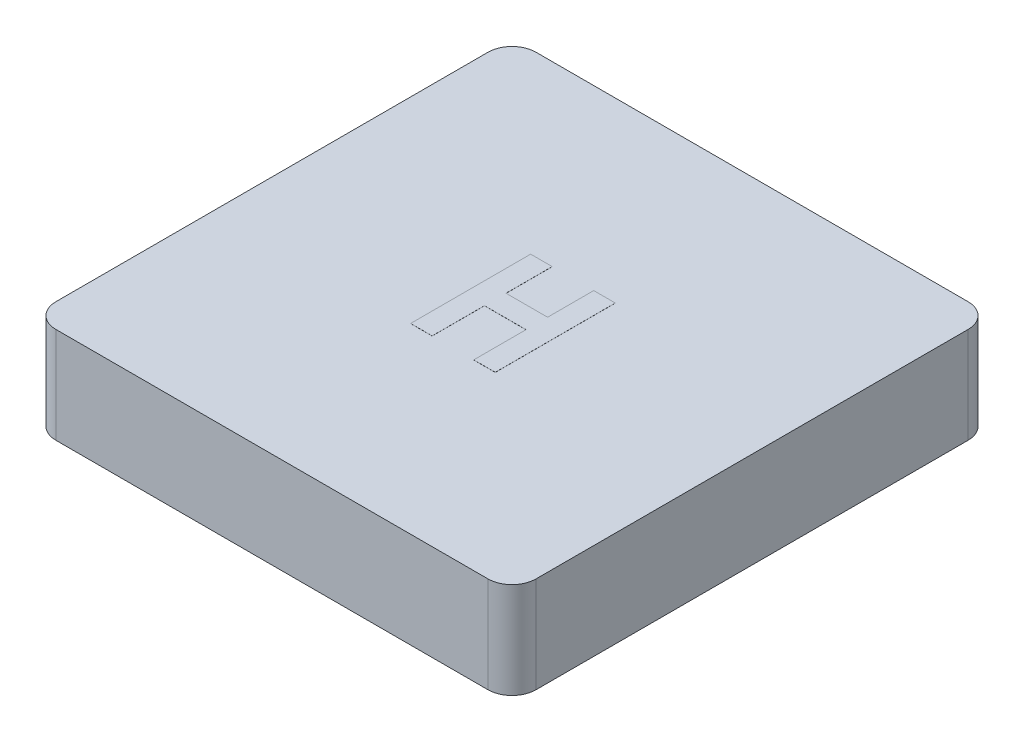
ISO-10303-21;
HEADER;
FILE_DESCRIPTION(('STEP AP214'),'2;1');
FILE_NAME('part.step','',(''),(''),'','','');
FILE_SCHEMA(('AUTOMOTIVE_DESIGN { 1 0 10303 214 1 1 1 1 }'));
ENDSEC;
DATA;
#1=APPLICATION_CONTEXT('core data for automotive mechanical design processes');
#2=APPLICATION_PROTOCOL_DEFINITION('international standard','automotive_design',2000,#1);
#3=PRODUCT_CONTEXT('',#1,'mechanical');
#4=PRODUCT('Part','Part','',(#3));
#5=PRODUCT_RELATED_PRODUCT_CATEGORY('part','',(#4));
#6=PRODUCT_DEFINITION_FORMATION('','',#4);
#7=PRODUCT_DEFINITION_CONTEXT('part definition',#1,'design');
#8=PRODUCT_DEFINITION('design','',#6,#7);
#9=PRODUCT_DEFINITION_SHAPE('','',#8);
#10=(LENGTH_UNIT() NAMED_UNIT(*) SI_UNIT(.MILLI.,.METRE.));
#11=(NAMED_UNIT(*) PLANE_ANGLE_UNIT() SI_UNIT($,.RADIAN.));
#12=(NAMED_UNIT(*) SI_UNIT($,.STERADIAN.) SOLID_ANGLE_UNIT());
#13=UNCERTAINTY_MEASURE_WITH_UNIT(LENGTH_MEASURE(1.E-05),#10,'distance_accuracy_value','');
#14=(GEOMETRIC_REPRESENTATION_CONTEXT(3) GLOBAL_UNCERTAINTY_ASSIGNED_CONTEXT((#13)) GLOBAL_UNIT_ASSIGNED_CONTEXT((#10,
#11,#12)) REPRESENTATION_CONTEXT('',''));
#15=CARTESIAN_POINT('',(0.,0.,0.));
#16=DIRECTION('',(0.,0.,1.));
#17=DIRECTION('',(1.,0.,0.));
#18=AXIS2_PLACEMENT_3D('',#15,#16,#17);
#19=CARTESIAN_POINT('',(0.,2.54,-12.7));
#20=DIRECTION('',(1.,0.,0.));
#21=DIRECTION('',(0.,0.,-1.));
#22=AXIS2_PLACEMENT_3D('',#19,#20,#21);
#23=PLANE('',#22);
#24=DIRECTION('',(0.,0.,1.));
#25=VECTOR('',#24,1.);
#26=CARTESIAN_POINT('',(0.,2.54,-12.7));
#27=LINE('',#26,#25);
#28=CARTESIAN_POINT('',(0.,2.54,-12.065));
#29=VERTEX_POINT('',#28);
#30=CARTESIAN_POINT('',(0.,2.54,-0.635));
#31=VERTEX_POINT('',#30);
#32=EDGE_CURVE('E336',#29,#31,#27,.T.);
#33=ORIENTED_EDGE('',*,*,#32,.F.);
#34=DIRECTION('',(0.,-1.,0.));
#35=VECTOR('',#34,1.);
#36=CARTESIAN_POINT('',(0.,2.54,-12.065));
#37=LINE('',#36,#35);
#38=CARTESIAN_POINT('',(0.,0.,-12.065));
#39=VERTEX_POINT('',#38);
#40=EDGE_CURVE('E361',#29,#39,#37,.T.);
#41=ORIENTED_EDGE('',*,*,#40,.T.);
#42=DIRECTION('',(0.,0.,1.));
#43=VECTOR('',#42,1.);
#44=CARTESIAN_POINT('',(0.,0.,-12.7));
#45=LINE('',#44,#43);
#46=CARTESIAN_POINT('',(0.,0.,-0.635));
#47=VERTEX_POINT('',#46);
#48=EDGE_CURVE('E316',#39,#47,#45,.T.);
#49=ORIENTED_EDGE('',*,*,#48,.T.);
#50=DIRECTION('',(0.,-1.,0.));
#51=VECTOR('',#50,1.);
#52=CARTESIAN_POINT('',(0.,2.54,-0.635));
#53=LINE('',#52,#51);
#54=EDGE_CURVE('E349',#47,#31,#53,.F.);
#55=ORIENTED_EDGE('',*,*,#54,.T.);
#56=EDGE_LOOP('',(#33,#41,#49,#55));
#57=FACE_BOUND('',#56,.T.);
#58=ADVANCED_FACE('F33',(#57),#23,.F.);
#59=CARTESIAN_POINT('',(0.,2.54,0.));
#60=DIRECTION('',(0.,0.,-1.));
#61=DIRECTION('',(-1.,0.,0.));
#62=AXIS2_PLACEMENT_3D('',#59,#60,#61);
#63=PLANE('',#62);
#64=DIRECTION('',(1.,0.,0.));
#65=VECTOR('',#64,1.);
#66=CARTESIAN_POINT('',(0.,0.,0.));
#67=LINE('',#66,#65);
#68=CARTESIAN_POINT('',(0.635,0.,0.));
#69=VERTEX_POINT('',#68);
#70=CARTESIAN_POINT('',(12.065,0.,0.));
#71=VERTEX_POINT('',#70);
#72=EDGE_CURVE('E352',#69,#71,#67,.T.);
#73=ORIENTED_EDGE('',*,*,#72,.T.);
#74=DIRECTION('',(0.,-1.,0.));
#75=VECTOR('',#74,1.);
#76=CARTESIAN_POINT('',(12.065,2.54,0.));
#77=LINE('',#76,#75);
#78=CARTESIAN_POINT('',(12.065,2.54,0.));
#79=VERTEX_POINT('',#78);
#80=EDGE_CURVE('E41',#71,#79,#77,.F.);
#81=ORIENTED_EDGE('',*,*,#80,.T.);
#82=DIRECTION('',(1.,0.,0.));
#83=VECTOR('',#82,1.);
#84=CARTESIAN_POINT('',(0.,2.54,0.));
#85=LINE('',#84,#83);
#86=CARTESIAN_POINT('',(0.635,2.54,0.));
#87=VERTEX_POINT('',#86);
#88=EDGE_CURVE('E339',#87,#79,#85,.T.);
#89=ORIENTED_EDGE('',*,*,#88,.F.);
#90=DIRECTION('',(0.,-1.,0.));
#91=VECTOR('',#90,1.);
#92=CARTESIAN_POINT('',(0.635,2.54,0.));
#93=LINE('',#92,#91);
#94=EDGE_CURVE('E390',#87,#69,#93,.T.);
#95=ORIENTED_EDGE('',*,*,#94,.T.);
#96=EDGE_LOOP('',(#73,#81,#89,#95));
#97=FACE_BOUND('',#96,.T.);
#98=ADVANCED_FACE('F395',(#97),#63,.F.);
#99=CARTESIAN_POINT('',(12.7,2.54,0.));
#100=DIRECTION('',(-1.,0.,0.));
#101=DIRECTION('',(0.,0.,1.));
#102=AXIS2_PLACEMENT_3D('',#99,#100,#101);
#103=PLANE('',#102);
#104=DIRECTION('',(0.,0.,-1.));
#105=VECTOR('',#104,1.);
#106=CARTESIAN_POINT('',(12.7,0.,0.));
#107=LINE('',#106,#105);
#108=CARTESIAN_POINT('',(12.7,0.,-0.635));
#109=VERTEX_POINT('',#108);
#110=CARTESIAN_POINT('',(12.7,0.,-12.065));
#111=VERTEX_POINT('',#110);
#112=EDGE_CURVE('E355',#109,#111,#107,.T.);
#113=ORIENTED_EDGE('',*,*,#112,.T.);
#114=DIRECTION('',(0.,-1.,0.));
#115=VECTOR('',#114,1.);
#116=CARTESIAN_POINT('',(12.7,2.54,-12.065));
#117=LINE('',#116,#115);
#118=CARTESIAN_POINT('',(12.7,2.54,-12.065));
#119=VERTEX_POINT('',#118);
#120=EDGE_CURVE('E388',#111,#119,#117,.F.);
#121=ORIENTED_EDGE('',*,*,#120,.T.);
#122=DIRECTION('',(0.,0.,-1.));
#123=VECTOR('',#122,1.);
#124=CARTESIAN_POINT('',(12.7,2.54,0.));
#125=LINE('',#124,#123);
#126=CARTESIAN_POINT('',(12.7,2.54,-0.635));
#127=VERTEX_POINT('',#126);
#128=EDGE_CURVE('E343',#127,#119,#125,.T.);
#129=ORIENTED_EDGE('',*,*,#128,.F.);
#130=DIRECTION('',(0.,-1.,0.));
#131=VECTOR('',#130,1.);
#132=CARTESIAN_POINT('',(12.7,2.54,-0.635));
#133=LINE('',#132,#131);
#134=EDGE_CURVE('E385',#127,#109,#133,.T.);
#135=ORIENTED_EDGE('',*,*,#134,.T.);
#136=EDGE_LOOP('',(#113,#121,#129,#135));
#137=FACE_BOUND('',#136,.T.);
#138=ADVANCED_FACE('F408',(#137),#103,.F.);
#139=CARTESIAN_POINT('',(12.7,2.54,-12.7));
#140=DIRECTION('',(0.,0.,1.));
#141=DIRECTION('',(1.,0.,0.));
#142=AXIS2_PLACEMENT_3D('',#139,#140,#141);
#143=PLANE('',#142);
#144=DIRECTION('',(-1.,0.,0.));
#145=VECTOR('',#144,1.);
#146=CARTESIAN_POINT('',(12.7,0.,-12.7));
#147=LINE('',#146,#145);
#148=CARTESIAN_POINT('',(12.065,0.,-12.7));
#149=VERTEX_POINT('',#148);
#150=CARTESIAN_POINT('',(0.634999999999995,0.,-12.7));
#151=VERTEX_POINT('',#150);
#152=EDGE_CURVE('E340',#149,#151,#147,.T.);
#153=ORIENTED_EDGE('',*,*,#152,.T.);
#154=DIRECTION('',(0.,-1.,0.));
#155=VECTOR('',#154,1.);
#156=CARTESIAN_POINT('',(0.634999999999995,2.54,-12.7));
#157=LINE('',#156,#155);
#158=CARTESIAN_POINT('',(0.634999999999995,2.54,-12.7));
#159=VERTEX_POINT('',#158);
#160=EDGE_CURVE('E375',#151,#159,#157,.F.);
#161=ORIENTED_EDGE('',*,*,#160,.T.);
#162=DIRECTION('',(-1.,0.,0.));
#163=VECTOR('',#162,1.);
#164=CARTESIAN_POINT('',(12.7,2.54,-12.7));
#165=LINE('',#164,#163);
#166=CARTESIAN_POINT('',(12.065,2.54,-12.7));
#167=VERTEX_POINT('',#166);
#168=EDGE_CURVE('E346',#167,#159,#165,.T.);
#169=ORIENTED_EDGE('',*,*,#168,.F.);
#170=DIRECTION('',(0.,-1.,0.));
#171=VECTOR('',#170,1.);
#172=CARTESIAN_POINT('',(12.065,2.54,-12.7));
#173=LINE('',#172,#171);
#174=EDGE_CURVE('E372',#167,#149,#173,.T.);
#175=ORIENTED_EDGE('',*,*,#174,.T.);
#176=EDGE_LOOP('',(#153,#161,#169,#175));
#177=FACE_BOUND('',#176,.T.);
#178=ADVANCED_FACE('F420',(#177),#143,.F.);
#179=CARTESIAN_POINT('',(0.,2.54,0.));
#180=DIRECTION('',(0.,1.,0.));
#181=DIRECTION('',(0.,0.,1.));
#182=AXIS2_PLACEMENT_3D('',#179,#180,#181);
#183=PLANE('',#182);
#184=DIRECTION('',(0.,0.,-1.));
#185=VECTOR('',#184,1.);
#186=CARTESIAN_POINT('',(5.19234615384615,2.54,-4.826));
#187=LINE('',#186,#185);
#188=CARTESIAN_POINT('',(5.19234615384615,2.54,-4.826));
#189=VERTEX_POINT('',#188);
#190=CARTESIAN_POINT('',(5.19234615384615,2.54,-8.001));
#191=VERTEX_POINT('',#190);
#192=EDGE_CURVE('E248',#189,#191,#187,.T.);
#193=ORIENTED_EDGE('',*,*,#192,.T.);
#194=DIRECTION('',(1.,0.,0.));
#195=VECTOR('',#194,1.);
#196=CARTESIAN_POINT('',(5.19234615384615,2.54,-8.001));
#197=LINE('',#196,#195);
#198=CARTESIAN_POINT('',(5.76221794871794,2.54,-8.001));
#199=VERTEX_POINT('',#198);
#200=EDGE_CURVE('E199',#191,#199,#197,.T.);
#201=ORIENTED_EDGE('',*,*,#200,.T.);
#202=DIRECTION('',(0.,0.,1.));
#203=VECTOR('',#202,1.);
#204=CARTESIAN_POINT('',(5.76221794871794,2.54,-8.001));
#205=LINE('',#204,#203);
#206=CARTESIAN_POINT('',(5.76221794871794,2.54,-6.77984615384615));
#207=VERTEX_POINT('',#206);
#208=EDGE_CURVE('E251',#199,#207,#205,.T.);
#209=ORIENTED_EDGE('',*,*,#208,.T.);
#210=DIRECTION('',(1.,0.,0.));
#211=VECTOR('',#210,1.);
#212=CARTESIAN_POINT('',(5.76221794871794,2.54,-6.77984615384615));
#213=LINE('',#212,#211);
#214=CARTESIAN_POINT('',(6.8612564102564,2.54,-6.77984615384615));
#215=VERTEX_POINT('',#214);
#216=EDGE_CURVE('E253',#207,#215,#213,.T.);
#217=ORIENTED_EDGE('',*,*,#216,.T.);
#218=DIRECTION('',(0.,0.,-1.));
#219=VECTOR('',#218,1.);
#220=CARTESIAN_POINT('',(6.8612564102564,2.54,-6.77984615384615));
#221=LINE('',#220,#219);
#222=CARTESIAN_POINT('',(6.8612564102564,2.54,-8.001));
#223=VERTEX_POINT('',#222);
#224=EDGE_CURVE('E255',#215,#223,#221,.T.);
#225=ORIENTED_EDGE('',*,*,#224,.T.);
#226=DIRECTION('',(1.,0.,0.));
#227=VECTOR('',#226,1.);
#228=CARTESIAN_POINT('',(6.8612564102564,2.54,-8.001));
#229=LINE('',#228,#227);
#230=CARTESIAN_POINT('',(7.4311282051282,2.54,-8.001));
#231=VERTEX_POINT('',#230);
#232=EDGE_CURVE('E257',#223,#231,#229,.T.);
#233=ORIENTED_EDGE('',*,*,#232,.T.);
#234=DIRECTION('',(0.,0.,1.));
#235=VECTOR('',#234,1.);
#236=CARTESIAN_POINT('',(7.4311282051282,2.54,-8.001));
#237=LINE('',#236,#235);
#238=CARTESIAN_POINT('',(7.4311282051282,2.54,-4.826));
#239=VERTEX_POINT('',#238);
#240=EDGE_CURVE('E259',#231,#239,#237,.T.);
#241=ORIENTED_EDGE('',*,*,#240,.T.);
#242=DIRECTION('',(-1.,0.,0.));
#243=VECTOR('',#242,1.);
#244=CARTESIAN_POINT('',(7.4311282051282,2.54,-4.826));
#245=LINE('',#244,#243);
#246=CARTESIAN_POINT('',(6.8612564102564,2.54,-4.826));
#247=VERTEX_POINT('',#246);
#248=EDGE_CURVE('E261',#239,#247,#245,.T.);
#249=ORIENTED_EDGE('',*,*,#248,.T.);
#250=DIRECTION('',(0.,0.,-1.));
#251=VECTOR('',#250,1.);
#252=CARTESIAN_POINT('',(6.8612564102564,2.54,-4.826));
#253=LINE('',#252,#251);
#254=CARTESIAN_POINT('',(6.8612564102564,2.54,-6.20997435897436));
#255=VERTEX_POINT('',#254);
#256=EDGE_CURVE('E263',#247,#255,#253,.T.);
#257=ORIENTED_EDGE('',*,*,#256,.T.);
#258=DIRECTION('',(-1.,0.,0.));
#259=VECTOR('',#258,1.);
#260=CARTESIAN_POINT('',(6.8612564102564,2.54,-6.20997435897436));
#261=LINE('',#260,#259);
#262=CARTESIAN_POINT('',(5.76221794871794,2.54,-6.20997435897436));
#263=VERTEX_POINT('',#262);
#264=EDGE_CURVE('E265',#255,#263,#261,.T.);
#265=ORIENTED_EDGE('',*,*,#264,.T.);
#266=DIRECTION('',(0.,0.,1.));
#267=VECTOR('',#266,1.);
#268=CARTESIAN_POINT('',(5.76221794871794,2.54,-6.20997435897436));
#269=LINE('',#268,#267);
#270=CARTESIAN_POINT('',(5.76221794871794,2.54,-4.826));
#271=VERTEX_POINT('',#270);
#272=EDGE_CURVE('E53',#263,#271,#269,.T.);
#273=ORIENTED_EDGE('',*,*,#272,.T.);
#274=DIRECTION('',(-1.,0.,0.));
#275=VECTOR('',#274,1.);
#276=CARTESIAN_POINT('',(5.76221794871794,2.54,-4.826));
#277=LINE('',#276,#275);
#278=EDGE_CURVE('E48',#271,#189,#277,.T.);
#279=ORIENTED_EDGE('',*,*,#278,.T.);
#280=EDGE_LOOP('',(#193,#201,#209,#217,#225,#233,#241,#249,#257,#265,#273,#279));
#281=FACE_BOUND('',#280,.T.);
#282=ORIENTED_EDGE('',*,*,#168,.T.);
#283=CARTESIAN_POINT('',(0.634999999999995,2.54,-12.065));
#284=DIRECTION('',(0.,1.,0.));
#285=DIRECTION('',(0.,0.,1.));
#286=AXIS2_PLACEMENT_3D('',#283,#284,#285);
#287=CIRCLE('',#286,0.635);
#288=EDGE_CURVE('E383',#159,#29,#287,.T.);
#289=ORIENTED_EDGE('',*,*,#288,.T.);
#290=ORIENTED_EDGE('',*,*,#32,.T.);
#291=CARTESIAN_POINT('',(0.635,2.54,-0.635));
#292=DIRECTION('',(0.,1.,0.));
#293=DIRECTION('',(0.,0.,1.));
#294=AXIS2_PLACEMENT_3D('',#291,#292,#293);
#295=CIRCLE('',#294,0.635);
#296=EDGE_CURVE('E377',#31,#87,#295,.T.);
#297=ORIENTED_EDGE('',*,*,#296,.T.);
#298=ORIENTED_EDGE('',*,*,#88,.T.);
#299=CARTESIAN_POINT('',(12.065,2.54,-0.635));
#300=DIRECTION('',(0.,1.,0.));
#301=DIRECTION('',(0.,0.,1.));
#302=AXIS2_PLACEMENT_3D('',#299,#300,#301);
#303=CIRCLE('',#302,0.635);
#304=EDGE_CURVE('E379',#79,#127,#303,.T.);
#305=ORIENTED_EDGE('',*,*,#304,.T.);
#306=ORIENTED_EDGE('',*,*,#128,.T.);
#307=CARTESIAN_POINT('',(12.065,2.54,-12.065));
#308=DIRECTION('',(0.,1.,0.));
#309=DIRECTION('',(0.,0.,1.));
#310=AXIS2_PLACEMENT_3D('',#307,#308,#309);
#311=CIRCLE('',#310,0.635);
#312=EDGE_CURVE('E381',#119,#167,#311,.T.);
#313=ORIENTED_EDGE('',*,*,#312,.T.);
#314=EDGE_LOOP('',(#282,#289,#290,#297,#298,#305,#306,#313));
#315=FACE_BOUND('',#314,.T.);
#316=ADVANCED_FACE('F401',(#281,#315),#183,.T.);
#317=CARTESIAN_POINT('',(0.,0.,0.));
#318=DIRECTION('',(0.,1.,0.));
#319=DIRECTION('',(0.,0.,1.));
#320=AXIS2_PLACEMENT_3D('',#317,#318,#319);
#321=PLANE('',#320);
#322=DIRECTION('',(-1.,0.,0.));
#323=VECTOR('',#322,1.);
#324=CARTESIAN_POINT('',(12.7,0.,-12.065));
#325=LINE('',#324,#323);
#326=CARTESIAN_POINT('',(12.065,0.,-12.065));
#327=VERTEX_POINT('',#326);
#328=CARTESIAN_POINT('',(0.634999999999995,0.,-12.065));
#329=VERTEX_POINT('',#328);
#330=EDGE_CURVE('E304',#327,#329,#325,.T.);
#331=ORIENTED_EDGE('',*,*,#330,.T.);
#332=DIRECTION('',(0.,0.,1.));
#333=VECTOR('',#332,1.);
#334=CARTESIAN_POINT('',(0.634999999999995,0.,-12.7));
#335=LINE('',#334,#333);
#336=CARTESIAN_POINT('',(0.635,0.,-0.635));
#337=VERTEX_POINT('',#336);
#338=EDGE_CURVE('E299',#329,#337,#335,.T.);
#339=ORIENTED_EDGE('',*,*,#338,.T.);
#340=DIRECTION('',(1.,0.,0.));
#341=VECTOR('',#340,1.);
#342=CARTESIAN_POINT('',(0.,0.,-0.635));
#343=LINE('',#342,#341);
#344=CARTESIAN_POINT('',(12.065,0.,-0.635));
#345=VERTEX_POINT('',#344);
#346=EDGE_CURVE('E328',#337,#345,#343,.T.);
#347=ORIENTED_EDGE('',*,*,#346,.T.);
#348=DIRECTION('',(0.,0.,-1.));
#349=VECTOR('',#348,1.);
#350=CARTESIAN_POINT('',(12.065,0.,0.));
#351=LINE('',#350,#349);
#352=EDGE_CURVE('E331',#345,#327,#351,.T.);
#353=ORIENTED_EDGE('',*,*,#352,.T.);
#354=EDGE_LOOP('',(#331,#339,#347,#353));
#355=FACE_BOUND('',#354,.T.);
#356=ORIENTED_EDGE('',*,*,#48,.F.);
#357=CARTESIAN_POINT('',(0.634999999999995,0.,-12.065));
#358=DIRECTION('',(0.,1.,0.));
#359=DIRECTION('',(0.,0.,1.));
#360=AXIS2_PLACEMENT_3D('',#357,#358,#359);
#361=CIRCLE('',#360,0.635);
#362=EDGE_CURVE('E370',#39,#151,#361,.F.);
#363=ORIENTED_EDGE('',*,*,#362,.T.);
#364=ORIENTED_EDGE('',*,*,#152,.F.);
#365=CARTESIAN_POINT('',(12.065,0.,-12.065));
#366=DIRECTION('',(0.,1.,0.));
#367=DIRECTION('',(0.,0.,1.));
#368=AXIS2_PLACEMENT_3D('',#365,#366,#367);
#369=CIRCLE('',#368,0.635);
#370=EDGE_CURVE('E368',#149,#111,#369,.F.);
#371=ORIENTED_EDGE('',*,*,#370,.T.);
#372=ORIENTED_EDGE('',*,*,#112,.F.);
#373=CARTESIAN_POINT('',(12.065,0.,-0.635));
#374=DIRECTION('',(0.,1.,0.));
#375=DIRECTION('',(0.,0.,1.));
#376=AXIS2_PLACEMENT_3D('',#373,#374,#375);
#377=CIRCLE('',#376,0.635);
#378=EDGE_CURVE('E366',#109,#71,#377,.F.);
#379=ORIENTED_EDGE('',*,*,#378,.T.);
#380=ORIENTED_EDGE('',*,*,#72,.F.);
#381=CARTESIAN_POINT('',(0.635,0.,-0.635));
#382=DIRECTION('',(0.,1.,0.));
#383=DIRECTION('',(0.,0.,1.));
#384=AXIS2_PLACEMENT_3D('',#381,#382,#383);
#385=CIRCLE('',#384,0.635);
#386=EDGE_CURVE('E364',#69,#47,#385,.F.);
#387=ORIENTED_EDGE('',*,*,#386,.T.);
#388=EDGE_LOOP('',(#356,#363,#364,#371,#372,#379,#380,#387));
#389=FACE_BOUND('',#388,.T.);
#390=ADVANCED_FACE('F412',(#355,#389),#321,.F.);
#391=CARTESIAN_POINT('',(0.634999999999995,2.54,-12.065));
#392=DIRECTION('',(0.,-1.,0.));
#393=DIRECTION('',(0.,0.,-1.));
#394=AXIS2_PLACEMENT_3D('',#391,#392,#393);
#395=CYLINDRICAL_SURFACE('',#394,0.635);
#396=ORIENTED_EDGE('',*,*,#288,.F.);
#397=ORIENTED_EDGE('',*,*,#160,.F.);
#398=ORIENTED_EDGE('',*,*,#362,.F.);
#399=ORIENTED_EDGE('',*,*,#40,.F.);
#400=EDGE_LOOP('',(#396,#397,#398,#399));
#401=FACE_BOUND('',#400,.T.);
#402=ADVANCED_FACE('F426',(#401),#395,.T.);
#403=CARTESIAN_POINT('',(12.065,2.54,-12.065));
#404=DIRECTION('',(0.,-1.,0.));
#405=DIRECTION('',(0.,0.,-1.));
#406=AXIS2_PLACEMENT_3D('',#403,#404,#405);
#407=CYLINDRICAL_SURFACE('',#406,0.635);
#408=ORIENTED_EDGE('',*,*,#312,.F.);
#409=ORIENTED_EDGE('',*,*,#120,.F.);
#410=ORIENTED_EDGE('',*,*,#370,.F.);
#411=ORIENTED_EDGE('',*,*,#174,.F.);
#412=EDGE_LOOP('',(#408,#409,#410,#411));
#413=FACE_BOUND('',#412,.T.);
#414=ADVANCED_FACE('F417',(#413),#407,.T.);
#415=CARTESIAN_POINT('',(12.065,2.54,-0.635));
#416=DIRECTION('',(0.,-1.,0.));
#417=DIRECTION('',(0.,0.,-1.));
#418=AXIS2_PLACEMENT_3D('',#415,#416,#417);
#419=CYLINDRICAL_SURFACE('',#418,0.635);
#420=ORIENTED_EDGE('',*,*,#304,.F.);
#421=ORIENTED_EDGE('',*,*,#80,.F.);
#422=ORIENTED_EDGE('',*,*,#378,.F.);
#423=ORIENTED_EDGE('',*,*,#134,.F.);
#424=EDGE_LOOP('',(#420,#421,#422,#423));
#425=FACE_BOUND('',#424,.T.);
#426=ADVANCED_FACE('F405',(#425),#419,.T.);
#427=CARTESIAN_POINT('',(0.635,2.54,-0.635));
#428=DIRECTION('',(0.,-1.,0.));
#429=DIRECTION('',(0.,0.,-1.));
#430=AXIS2_PLACEMENT_3D('',#427,#428,#429);
#431=CYLINDRICAL_SURFACE('',#430,0.635);
#432=ORIENTED_EDGE('',*,*,#296,.F.);
#433=ORIENTED_EDGE('',*,*,#54,.F.);
#434=ORIENTED_EDGE('',*,*,#386,.F.);
#435=ORIENTED_EDGE('',*,*,#94,.F.);
#436=EDGE_LOOP('',(#432,#433,#434,#435));
#437=FACE_BOUND('',#436,.T.);
#438=ADVANCED_FACE('F35',(#437),#431,.T.);
#439=CARTESIAN_POINT('',(0.634999999999995,2.54,-12.7));
#440=DIRECTION('',(1.,0.,0.));
#441=DIRECTION('',(0.,0.,-1.));
#442=AXIS2_PLACEMENT_3D('',#439,#440,#441);
#443=PLANE('',#442);
#444=DIRECTION('',(0.,0.,1.));
#445=VECTOR('',#444,1.);
#446=CARTESIAN_POINT('',(0.634999999999995,1.905,-12.7));
#447=LINE('',#446,#445);
#448=CARTESIAN_POINT('',(0.634999999999995,1.905,-12.065));
#449=VERTEX_POINT('',#448);
#450=CARTESIAN_POINT('',(0.635,1.905,-0.635));
#451=VERTEX_POINT('',#450);
#452=EDGE_CURVE('E300',#449,#451,#447,.T.);
#453=ORIENTED_EDGE('',*,*,#452,.T.);
#454=DIRECTION('',(0.,1.,0.));
#455=VECTOR('',#454,1.);
#456=CARTESIAN_POINT('',(0.635,2.54,-0.635));
#457=LINE('',#456,#455);
#458=EDGE_CURVE('E309',#337,#451,#457,.T.);
#459=ORIENTED_EDGE('',*,*,#458,.F.);
#460=ORIENTED_EDGE('',*,*,#338,.F.);
#461=DIRECTION('',(0.,1.,0.));
#462=VECTOR('',#461,1.);
#463=CARTESIAN_POINT('',(0.634999999999995,2.54,-12.065));
#464=LINE('',#463,#462);
#465=EDGE_CURVE('E305',#329,#449,#464,.T.);
#466=ORIENTED_EDGE('',*,*,#465,.T.);
#467=EDGE_LOOP('',(#453,#459,#460,#466));
#468=FACE_BOUND('',#467,.T.);
#469=ADVANCED_FACE('F431',(#468),#443,.T.);
#470=CARTESIAN_POINT('',(0.,2.54,-0.635));
#471=DIRECTION('',(0.,0.,-1.));
#472=DIRECTION('',(-1.,0.,0.));
#473=AXIS2_PLACEMENT_3D('',#470,#471,#472);
#474=PLANE('',#473);
#475=ORIENTED_EDGE('',*,*,#346,.F.);
#476=ORIENTED_EDGE('',*,*,#458,.T.);
#477=DIRECTION('',(1.,0.,0.));
#478=VECTOR('',#477,1.);
#479=CARTESIAN_POINT('',(0.,1.905,-0.635));
#480=LINE('',#479,#478);
#481=CARTESIAN_POINT('',(12.065,1.905,-0.635));
#482=VERTEX_POINT('',#481);
#483=EDGE_CURVE('E303',#451,#482,#480,.T.);
#484=ORIENTED_EDGE('',*,*,#483,.T.);
#485=DIRECTION('',(0.,1.,0.));
#486=VECTOR('',#485,1.);
#487=CARTESIAN_POINT('',(12.065,2.54,-0.635));
#488=LINE('',#487,#486);
#489=EDGE_CURVE('E313',#345,#482,#488,.T.);
#490=ORIENTED_EDGE('',*,*,#489,.F.);
#491=EDGE_LOOP('',(#475,#476,#484,#490));
#492=FACE_BOUND('',#491,.T.);
#493=ADVANCED_FACE('F436',(#492),#474,.T.);
#494=CARTESIAN_POINT('',(12.065,2.54,0.));
#495=DIRECTION('',(-1.,0.,0.));
#496=DIRECTION('',(0.,0.,1.));
#497=AXIS2_PLACEMENT_3D('',#494,#495,#496);
#498=PLANE('',#497);
#499=ORIENTED_EDGE('',*,*,#352,.F.);
#500=ORIENTED_EDGE('',*,*,#489,.T.);
#501=DIRECTION('',(0.,0.,-1.));
#502=VECTOR('',#501,1.);
#503=CARTESIAN_POINT('',(12.065,1.905,0.));
#504=LINE('',#503,#502);
#505=CARTESIAN_POINT('',(12.065,1.905,-12.065));
#506=VERTEX_POINT('',#505);
#507=EDGE_CURVE('E319',#482,#506,#504,.T.);
#508=ORIENTED_EDGE('',*,*,#507,.T.);
#509=DIRECTION('',(0.,1.,0.));
#510=VECTOR('',#509,1.);
#511=CARTESIAN_POINT('',(12.065,2.54,-12.065));
#512=LINE('',#511,#510);
#513=EDGE_CURVE('E308',#327,#506,#512,.T.);
#514=ORIENTED_EDGE('',*,*,#513,.F.);
#515=EDGE_LOOP('',(#499,#500,#508,#514));
#516=FACE_BOUND('',#515,.T.);
#517=ADVANCED_FACE('F489',(#516),#498,.T.);
#518=CARTESIAN_POINT('',(12.7,2.54,-12.065));
#519=DIRECTION('',(0.,0.,1.));
#520=DIRECTION('',(1.,0.,0.));
#521=AXIS2_PLACEMENT_3D('',#518,#519,#520);
#522=PLANE('',#521);
#523=ORIENTED_EDGE('',*,*,#330,.F.);
#524=ORIENTED_EDGE('',*,*,#513,.T.);
#525=DIRECTION('',(-1.,0.,0.));
#526=VECTOR('',#525,1.);
#527=CARTESIAN_POINT('',(12.7,1.905,-12.065));
#528=LINE('',#527,#526);
#529=EDGE_CURVE('E312',#506,#449,#528,.T.);
#530=ORIENTED_EDGE('',*,*,#529,.T.);
#531=ORIENTED_EDGE('',*,*,#465,.F.);
#532=EDGE_LOOP('',(#523,#524,#530,#531));
#533=FACE_BOUND('',#532,.T.);
#534=ADVANCED_FACE('F499',(#533),#522,.T.);
#535=CARTESIAN_POINT('',(0.,1.905,0.));
#536=DIRECTION('',(0.,1.,0.));
#537=DIRECTION('',(0.,0.,1.));
#538=AXIS2_PLACEMENT_3D('',#535,#536,#537);
#539=PLANE('',#538);
#540=CARTESIAN_POINT('',(6.34999999999999,1.905,-6.35));
#541=DIRECTION('',(0.,1.,0.));
#542=DIRECTION('',(0.,0.,1.));
#543=AXIS2_PLACEMENT_3D('',#540,#541,#542);
#544=CIRCLE('',#543,2.54);
#545=CARTESIAN_POINT('',(6.34999999999999,1.905,-3.81));
#546=VERTEX_POINT('',#545);
#547=EDGE_CURVE('E11',#546,#546,#544,.F.);
#548=ORIENTED_EDGE('',*,*,#547,.F.);
#549=EDGE_LOOP('',(#548));
#550=FACE_BOUND('',#549,.T.);
#551=ORIENTED_EDGE('',*,*,#529,.F.);
#552=ORIENTED_EDGE('',*,*,#507,.F.);
#553=ORIENTED_EDGE('',*,*,#483,.F.);
#554=ORIENTED_EDGE('',*,*,#452,.F.);
#555=EDGE_LOOP('',(#551,#552,#553,#554));
#556=FACE_BOUND('',#555,.T.);
#557=ADVANCED_FACE('F509',(#550,#556),#539,.F.);
#558=CARTESIAN_POINT('',(6.34999999999999,-7.18420489685532,-6.35));
#559=DIRECTION('',(0.,1.,0.));
#560=DIRECTION('',(0.,0.,1.));
#561=AXIS2_PLACEMENT_3D('',#558,#559,#560);
#562=CYLINDRICAL_SURFACE('',#561,2.54);
#563=CARTESIAN_POINT('',(6.34999999999999,0.,-6.35));
#564=DIRECTION('',(0.,1.,0.));
#565=DIRECTION('',(0.,0.,1.));
#566=AXIS2_PLACEMENT_3D('',#563,#564,#565);
#567=CIRCLE('',#566,2.54);
#568=CARTESIAN_POINT('',(6.34999999999999,0.,-3.81));
#569=VERTEX_POINT('',#568);
#570=EDGE_CURVE('E269',#569,#569,#567,.T.);
#571=CARTESIAN_POINT('',(6.34999999999999,0.,-3.81));
#572=CARTESIAN_POINT('',(6.34999999999999,0.0198437499999991,-3.81));
#573=CARTESIAN_POINT('',(6.34999999999999,0.0396874999999989,-3.81));
#574=CARTESIAN_POINT('',(6.34999999999999,0.079374999999999,-3.81));
#575=CARTESIAN_POINT('',(6.34999999999999,0.0992187499999992,-3.81));
#576=CARTESIAN_POINT('',(6.34999999999999,0.138906249999999,-3.81));
#577=CARTESIAN_POINT('',(6.34999999999999,0.158749999999999,-3.81));
#578=CARTESIAN_POINT('',(6.34999999999999,0.198437499999999,-3.81));
#579=CARTESIAN_POINT('',(6.34999999999999,0.218281249999999,-3.81));
#580=CARTESIAN_POINT('',(6.34999999999999,0.25796875,-3.81));
#581=CARTESIAN_POINT('',(6.34999999999999,0.277812499999999,-3.81));
#582=CARTESIAN_POINT('',(6.34999999999999,0.317499999999999,-3.81));
#583=CARTESIAN_POINT('',(6.34999999999999,0.337343749999999,-3.81));
#584=CARTESIAN_POINT('',(6.34999999999999,0.377031249999999,-3.81));
#585=CARTESIAN_POINT('',(6.34999999999999,0.396874999999999,-3.81));
#586=CARTESIAN_POINT('',(6.34999999999999,0.436562499999999,-3.81));
#587=CARTESIAN_POINT('',(6.34999999999999,0.456406249999999,-3.81));
#588=CARTESIAN_POINT('',(6.34999999999999,0.496093749999999,-3.81));
#589=CARTESIAN_POINT('',(6.34999999999999,0.515937499999999,-3.81));
#590=CARTESIAN_POINT('',(6.34999999999999,0.555624999999999,-3.81));
#591=CARTESIAN_POINT('',(6.34999999999999,0.575468749999999,-3.81));
#592=CARTESIAN_POINT('',(6.34999999999999,0.615156249999999,-3.81));
#593=CARTESIAN_POINT('',(6.34999999999999,0.634999999999999,-3.81));
#594=CARTESIAN_POINT('',(6.34999999999999,0.674687499999998,-3.81));
#595=CARTESIAN_POINT('',(6.34999999999999,0.694531249999998,-3.81));
#596=CARTESIAN_POINT('',(6.34999999999999,0.734218749999998,-3.81));
#597=CARTESIAN_POINT('',(6.34999999999999,0.754062499999998,-3.81));
#598=CARTESIAN_POINT('',(6.34999999999999,0.793749999999998,-3.81));
#599=CARTESIAN_POINT('',(6.34999999999999,0.813593749999999,-3.81));
#600=CARTESIAN_POINT('',(6.34999999999999,0.853281249999999,-3.81));
#601=CARTESIAN_POINT('',(6.34999999999999,0.873124999999999,-3.81));
#602=CARTESIAN_POINT('',(6.34999999999999,0.912812499999999,-3.81));
#603=CARTESIAN_POINT('',(6.34999999999999,0.932656249999999,-3.81));
#604=CARTESIAN_POINT('',(6.34999999999999,0.972343749999998,-3.81));
#605=CARTESIAN_POINT('',(6.34999999999999,0.992187499999998,-3.81));
#606=CARTESIAN_POINT('',(6.34999999999999,1.031875,-3.81));
#607=CARTESIAN_POINT('',(6.34999999999999,1.05171875,-3.81));
#608=CARTESIAN_POINT('',(6.34999999999999,1.09140625,-3.81));
#609=CARTESIAN_POINT('',(6.34999999999999,1.11125,-3.81));
#610=CARTESIAN_POINT('',(6.34999999999999,1.1509375,-3.81));
#611=CARTESIAN_POINT('',(6.34999999999999,1.17078125,-3.81));
#612=CARTESIAN_POINT('',(6.34999999999999,1.21046875,-3.81));
#613=CARTESIAN_POINT('',(6.34999999999999,1.2303125,-3.81));
#614=CARTESIAN_POINT('',(6.34999999999999,1.27,-3.81));
#615=CARTESIAN_POINT('',(6.34999999999999,1.28984375,-3.81));
#616=CARTESIAN_POINT('',(6.34999999999999,1.32953125,-3.81));
#617=CARTESIAN_POINT('',(6.34999999999999,1.349375,-3.81));
#618=CARTESIAN_POINT('',(6.34999999999999,1.3890625,-3.81));
#619=CARTESIAN_POINT('',(6.34999999999999,1.40890625,-3.81));
#620=CARTESIAN_POINT('',(6.34999999999999,1.44859375,-3.81));
#621=CARTESIAN_POINT('',(6.34999999999999,1.4684375,-3.81));
#622=CARTESIAN_POINT('',(6.34999999999999,1.508125,-3.81));
#623=CARTESIAN_POINT('',(6.34999999999999,1.52796875,-3.81));
#624=CARTESIAN_POINT('',(6.34999999999999,1.56765625,-3.81));
#625=CARTESIAN_POINT('',(6.34999999999999,1.5875,-3.81));
#626=CARTESIAN_POINT('',(6.34999999999999,1.6271875,-3.81));
#627=CARTESIAN_POINT('',(6.34999999999999,1.64703125,-3.81));
#628=CARTESIAN_POINT('',(6.34999999999999,1.68671875,-3.81));
#629=CARTESIAN_POINT('',(6.34999999999999,1.7065625,-3.81));
#630=CARTESIAN_POINT('',(6.34999999999999,1.74625,-3.81));
#631=CARTESIAN_POINT('',(6.34999999999999,1.76609375,-3.81));
#632=CARTESIAN_POINT('',(6.34999999999999,1.80578125,-3.81));
#633=CARTESIAN_POINT('',(6.34999999999999,1.825625,-3.81));
#634=CARTESIAN_POINT('',(6.34999999999999,1.8653125,-3.81));
#635=CARTESIAN_POINT('',(6.34999999999999,1.88515625,-3.81));
#636=CARTESIAN_POINT('',(6.34999999999999,1.905,-3.81));
#637=B_SPLINE_CURVE_WITH_KNOTS('',3,(#571,#572,#573,#574,#575,#576,#577,#578,#579,#580,#581,
#582,#583,#584,#585,#586,#587,#588,#589,#590,#591,#592,#593,#594,#595,#596,#597,#598,#599,#600,
#601,#602,#603,#604,#605,#606,#607,#608,#609,#610,#611,#612,#613,#614,#615,#616,#617,#618,#619,
#620,#621,#622,#623,#624,#625,#626,#627,#628,#629,#630,#631,#632,#633,#634,#635,#636),
.UNSPECIFIED.,.F.,.F.,(4,2,2,2,2,2,2,2,2,2,2,2,2,2,2,2,2,2,2,2,2,2,2,2,2,2,2,2,2,2,2,2,4),(0.,
0.0595312499999997,0.1190625,0.17859375,0.238125,0.29765625,0.3571875,0.41671875,0.47625,
0.53578125,0.5953125,0.654843749999999,0.714374999999999,0.773906249999999,0.8334375,0.89296875,
0.952499999999999,1.01203125,1.0715625,1.13109375,1.190625,1.25015625,1.3096875,1.36921875,
1.42875,1.48828125,1.5478125,1.60734375,1.666875,1.72640625,1.7859375,1.84546875,1.905),.UNSPECIFIED.);
#638=EDGE_CURVE('BSEAM519',#569,#546,#637,.T.);
#639=ORIENTED_EDGE('',*,*,#570,.T.);
#640=ORIENTED_EDGE('',*,*,#547,.T.);
#641=ORIENTED_EDGE('',*,*,#638,.T.);
#642=ORIENTED_EDGE('',*,*,#638,.F.);
#643=EDGE_LOOP('',(#639,#641,#640,#642));
#644=FACE_BOUND('',#643,.T.);
#645=ADVANCED_FACE('F519',(#644),#562,.T.);
#646=CARTESIAN_POINT('',(0.,0.,0.));
#647=DIRECTION('',(0.,1.,0.));
#648=DIRECTION('',(0.,0.,1.));
#649=AXIS2_PLACEMENT_3D('',#646,#647,#648);
#650=PLANE('',#649);
#651=ORIENTED_EDGE('',*,*,#570,.F.);
#652=EDGE_LOOP('',(#651));
#653=FACE_BOUND('',#652,.T.);
#654=ADVANCED_FACE('F529',(#653),#650,.F.);
#655=CARTESIAN_POINT('',(5.19234615384615,2.54254,-4.826));
#656=DIRECTION('',(-1.,0.,0.));
#657=DIRECTION('',(0.,0.,1.));
#658=AXIS2_PLACEMENT_3D('',#655,#656,#657);
#659=PLANE('',#658);
#660=ORIENTED_EDGE('',*,*,#192,.F.);
#661=DIRECTION('',(0.,-1.,0.));
#662=VECTOR('',#661,1.);
#663=CARTESIAN_POINT('',(5.19234615384615,2.54254,-4.826));
#664=LINE('',#663,#662);
#665=CARTESIAN_POINT('',(5.19234615384615,2.54254,-4.826));
#666=VERTEX_POINT('',#665);
#667=EDGE_CURVE('E218',#666,#189,#664,.T.);
#668=ORIENTED_EDGE('',*,*,#667,.F.);
#669=DIRECTION('',(0.,0.,-1.));
#670=VECTOR('',#669,1.);
#671=CARTESIAN_POINT('',(5.19234615384615,2.54254,-4.826));
#672=LINE('',#671,#670);
#673=CARTESIAN_POINT('',(5.19234615384615,2.54254,-8.001));
#674=VERTEX_POINT('',#673);
#675=EDGE_CURVE('E211',#666,#674,#672,.T.);
#676=ORIENTED_EDGE('',*,*,#675,.T.);
#677=DIRECTION('',(0.,-1.,0.));
#678=VECTOR('',#677,1.);
#679=CARTESIAN_POINT('',(5.19234615384615,2.54254,-8.001));
#680=LINE('',#679,#678);
#681=EDGE_CURVE('E194',#674,#191,#680,.T.);
#682=ORIENTED_EDGE('',*,*,#681,.T.);
#683=EDGE_LOOP('',(#660,#668,#676,#682));
#684=FACE_BOUND('',#683,.T.);
#685=ADVANCED_FACE('F217',(#684),#659,.T.);
#686=CARTESIAN_POINT('',(5.76221794871794,2.54254,-4.826));
#687=DIRECTION('',(0.,0.,1.));
#688=DIRECTION('',(1.,0.,0.));
#689=AXIS2_PLACEMENT_3D('',#686,#687,#688);
#690=PLANE('',#689);
#691=ORIENTED_EDGE('',*,*,#278,.F.);
#692=DIRECTION('',(0.,-1.,0.));
#693=VECTOR('',#692,1.);
#694=CARTESIAN_POINT('',(5.76221794871794,2.54254,-4.826));
#695=LINE('',#694,#693);
#696=CARTESIAN_POINT('',(5.76221794871794,2.54254,-4.826));
#697=VERTEX_POINT('',#696);
#698=EDGE_CURVE('E270',#697,#271,#695,.T.);
#699=ORIENTED_EDGE('',*,*,#698,.F.);
#700=DIRECTION('',(-1.,0.,0.));
#701=VECTOR('',#700,1.);
#702=CARTESIAN_POINT('',(5.76221794871794,2.54254,-4.826));
#703=LINE('',#702,#701);
#704=EDGE_CURVE('E204',#697,#666,#703,.T.);
#705=ORIENTED_EDGE('',*,*,#704,.T.);
#706=ORIENTED_EDGE('',*,*,#667,.T.);
#707=EDGE_LOOP('',(#691,#699,#705,#706));
#708=FACE_BOUND('',#707,.T.);
#709=ADVANCED_FACE('F556',(#708),#690,.T.);
#710=CARTESIAN_POINT('',(5.76221794871794,2.54254,-6.20997435897436));
#711=DIRECTION('',(1.,0.,0.));
#712=DIRECTION('',(0.,0.,-1.));
#713=AXIS2_PLACEMENT_3D('',#710,#711,#712);
#714=PLANE('',#713);
#715=ORIENTED_EDGE('',*,*,#272,.F.);
#716=DIRECTION('',(0.,-1.,0.));
#717=VECTOR('',#716,1.);
#718=CARTESIAN_POINT('',(5.76221794871794,2.54254,-6.20997435897436));
#719=LINE('',#718,#717);
#720=CARTESIAN_POINT('',(5.76221794871794,2.54254,-6.20997435897436));
#721=VERTEX_POINT('',#720);
#722=EDGE_CURVE('E272',#721,#263,#719,.T.);
#723=ORIENTED_EDGE('',*,*,#722,.F.);
#724=DIRECTION('',(0.,0.,1.));
#725=VECTOR('',#724,1.);
#726=CARTESIAN_POINT('',(5.76221794871794,2.54254,-6.20997435897436));
#727=LINE('',#726,#725);
#728=EDGE_CURVE('E244',#721,#697,#727,.T.);
#729=ORIENTED_EDGE('',*,*,#728,.T.);
#730=ORIENTED_EDGE('',*,*,#698,.T.);
#731=EDGE_LOOP('',(#715,#723,#729,#730));
#732=FACE_BOUND('',#731,.T.);
#733=ADVANCED_FACE('F565',(#732),#714,.T.);
#734=CARTESIAN_POINT('',(6.8612564102564,2.54254,-6.20997435897436));
#735=DIRECTION('',(0.,0.,1.));
#736=DIRECTION('',(1.,0.,0.));
#737=AXIS2_PLACEMENT_3D('',#734,#735,#736);
#738=PLANE('',#737);
#739=ORIENTED_EDGE('',*,*,#264,.F.);
#740=DIRECTION('',(0.,-1.,0.));
#741=VECTOR('',#740,1.);
#742=CARTESIAN_POINT('',(6.8612564102564,2.54254,-6.20997435897436));
#743=LINE('',#742,#741);
#744=CARTESIAN_POINT('',(6.8612564102564,2.54254,-6.20997435897436));
#745=VERTEX_POINT('',#744);
#746=EDGE_CURVE('E275',#745,#255,#743,.T.);
#747=ORIENTED_EDGE('',*,*,#746,.F.);
#748=DIRECTION('',(-1.,0.,0.));
#749=VECTOR('',#748,1.);
#750=CARTESIAN_POINT('',(6.8612564102564,2.54254,-6.20997435897436));
#751=LINE('',#750,#749);
#752=EDGE_CURVE('E241',#745,#721,#751,.T.);
#753=ORIENTED_EDGE('',*,*,#752,.T.);
#754=ORIENTED_EDGE('',*,*,#722,.T.);
#755=EDGE_LOOP('',(#739,#747,#753,#754));
#756=FACE_BOUND('',#755,.T.);
#757=ADVANCED_FACE('F575',(#756),#738,.T.);
#758=CARTESIAN_POINT('',(6.8612564102564,2.54254,-4.826));
#759=DIRECTION('',(-1.,0.,0.));
#760=DIRECTION('',(0.,0.,1.));
#761=AXIS2_PLACEMENT_3D('',#758,#759,#760);
#762=PLANE('',#761);
#763=ORIENTED_EDGE('',*,*,#256,.F.);
#764=DIRECTION('',(0.,-1.,0.));
#765=VECTOR('',#764,1.);
#766=CARTESIAN_POINT('',(6.8612564102564,2.54254,-4.826));
#767=LINE('',#766,#765);
#768=CARTESIAN_POINT('',(6.8612564102564,2.54254,-4.826));
#769=VERTEX_POINT('',#768);
#770=EDGE_CURVE('E278',#769,#247,#767,.T.);
#771=ORIENTED_EDGE('',*,*,#770,.F.);
#772=DIRECTION('',(0.,0.,-1.));
#773=VECTOR('',#772,1.);
#774=CARTESIAN_POINT('',(6.8612564102564,2.54254,-4.826));
#775=LINE('',#774,#773);
#776=EDGE_CURVE('E238',#769,#745,#775,.T.);
#777=ORIENTED_EDGE('',*,*,#776,.T.);
#778=ORIENTED_EDGE('',*,*,#746,.T.);
#779=EDGE_LOOP('',(#763,#771,#777,#778));
#780=FACE_BOUND('',#779,.T.);
#781=ADVANCED_FACE('F585',(#780),#762,.T.);
#782=CARTESIAN_POINT('',(7.4311282051282,2.54254,-4.826));
#783=DIRECTION('',(0.,0.,1.));
#784=DIRECTION('',(1.,0.,0.));
#785=AXIS2_PLACEMENT_3D('',#782,#783,#784);
#786=PLANE('',#785);
#787=ORIENTED_EDGE('',*,*,#248,.F.);
#788=DIRECTION('',(0.,-1.,0.));
#789=VECTOR('',#788,1.);
#790=CARTESIAN_POINT('',(7.4311282051282,2.54254,-4.826));
#791=LINE('',#790,#789);
#792=CARTESIAN_POINT('',(7.4311282051282,2.54254,-4.826));
#793=VERTEX_POINT('',#792);
#794=EDGE_CURVE('E281',#793,#239,#791,.T.);
#795=ORIENTED_EDGE('',*,*,#794,.F.);
#796=DIRECTION('',(-1.,0.,0.));
#797=VECTOR('',#796,1.);
#798=CARTESIAN_POINT('',(7.4311282051282,2.54254,-4.826));
#799=LINE('',#798,#797);
#800=EDGE_CURVE('E235',#793,#769,#799,.T.);
#801=ORIENTED_EDGE('',*,*,#800,.T.);
#802=ORIENTED_EDGE('',*,*,#770,.T.);
#803=EDGE_LOOP('',(#787,#795,#801,#802));
#804=FACE_BOUND('',#803,.T.);
#805=ADVANCED_FACE('F595',(#804),#786,.T.);
#806=CARTESIAN_POINT('',(7.4311282051282,2.54254,-8.001));
#807=DIRECTION('',(1.,0.,0.));
#808=DIRECTION('',(0.,0.,-1.));
#809=AXIS2_PLACEMENT_3D('',#806,#807,#808);
#810=PLANE('',#809);
#811=ORIENTED_EDGE('',*,*,#240,.F.);
#812=DIRECTION('',(0.,-1.,0.));
#813=VECTOR('',#812,1.);
#814=CARTESIAN_POINT('',(7.4311282051282,2.54254,-8.001));
#815=LINE('',#814,#813);
#816=CARTESIAN_POINT('',(7.4311282051282,2.54254,-8.001));
#817=VERTEX_POINT('',#816);
#818=EDGE_CURVE('E284',#817,#231,#815,.T.);
#819=ORIENTED_EDGE('',*,*,#818,.F.);
#820=DIRECTION('',(0.,0.,1.));
#821=VECTOR('',#820,1.);
#822=CARTESIAN_POINT('',(7.4311282051282,2.54254,-8.001));
#823=LINE('',#822,#821);
#824=EDGE_CURVE('E232',#817,#793,#823,.T.);
#825=ORIENTED_EDGE('',*,*,#824,.T.);
#826=ORIENTED_EDGE('',*,*,#794,.T.);
#827=EDGE_LOOP('',(#811,#819,#825,#826));
#828=FACE_BOUND('',#827,.T.);
#829=ADVANCED_FACE('F605',(#828),#810,.T.);
#830=CARTESIAN_POINT('',(6.8612564102564,2.54254,-8.001));
#831=DIRECTION('',(0.,0.,-1.));
#832=DIRECTION('',(-1.,0.,0.));
#833=AXIS2_PLACEMENT_3D('',#830,#831,#832);
#834=PLANE('',#833);
#835=ORIENTED_EDGE('',*,*,#232,.F.);
#836=DIRECTION('',(0.,-1.,0.));
#837=VECTOR('',#836,1.);
#838=CARTESIAN_POINT('',(6.8612564102564,2.54254,-8.001));
#839=LINE('',#838,#837);
#840=CARTESIAN_POINT('',(6.8612564102564,2.54254,-8.001));
#841=VERTEX_POINT('',#840);
#842=EDGE_CURVE('E287',#841,#223,#839,.T.);
#843=ORIENTED_EDGE('',*,*,#842,.F.);
#844=DIRECTION('',(1.,0.,0.));
#845=VECTOR('',#844,1.);
#846=CARTESIAN_POINT('',(6.8612564102564,2.54254,-8.001));
#847=LINE('',#846,#845);
#848=EDGE_CURVE('E229',#841,#817,#847,.T.);
#849=ORIENTED_EDGE('',*,*,#848,.T.);
#850=ORIENTED_EDGE('',*,*,#818,.T.);
#851=EDGE_LOOP('',(#835,#843,#849,#850));
#852=FACE_BOUND('',#851,.T.);
#853=ADVANCED_FACE('F615',(#852),#834,.T.);
#854=CARTESIAN_POINT('',(6.8612564102564,2.54254,-6.77984615384615));
#855=DIRECTION('',(-1.,0.,0.));
#856=DIRECTION('',(0.,0.,1.));
#857=AXIS2_PLACEMENT_3D('',#854,#855,#856);
#858=PLANE('',#857);
#859=ORIENTED_EDGE('',*,*,#224,.F.);
#860=DIRECTION('',(0.,-1.,0.));
#861=VECTOR('',#860,1.);
#862=CARTESIAN_POINT('',(6.8612564102564,2.54254,-6.77984615384615));
#863=LINE('',#862,#861);
#864=CARTESIAN_POINT('',(6.8612564102564,2.54254,-6.77984615384615));
#865=VERTEX_POINT('',#864);
#866=EDGE_CURVE('E290',#865,#215,#863,.T.);
#867=ORIENTED_EDGE('',*,*,#866,.F.);
#868=DIRECTION('',(0.,0.,-1.));
#869=VECTOR('',#868,1.);
#870=CARTESIAN_POINT('',(6.8612564102564,2.54254,-6.77984615384615));
#871=LINE('',#870,#869);
#872=EDGE_CURVE('E226',#865,#841,#871,.T.);
#873=ORIENTED_EDGE('',*,*,#872,.T.);
#874=ORIENTED_EDGE('',*,*,#842,.T.);
#875=EDGE_LOOP('',(#859,#867,#873,#874));
#876=FACE_BOUND('',#875,.T.);
#877=ADVANCED_FACE('F625',(#876),#858,.T.);
#878=CARTESIAN_POINT('',(5.76221794871794,2.54254,-6.77984615384615));
#879=DIRECTION('',(0.,0.,-1.));
#880=DIRECTION('',(-1.,0.,0.));
#881=AXIS2_PLACEMENT_3D('',#878,#879,#880);
#882=PLANE('',#881);
#883=ORIENTED_EDGE('',*,*,#216,.F.);
#884=DIRECTION('',(0.,-1.,0.));
#885=VECTOR('',#884,1.);
#886=CARTESIAN_POINT('',(5.76221794871794,2.54254,-6.77984615384615));
#887=LINE('',#886,#885);
#888=CARTESIAN_POINT('',(5.76221794871794,2.54254,-6.77984615384615));
#889=VERTEX_POINT('',#888);
#890=EDGE_CURVE('E293',#889,#207,#887,.T.);
#891=ORIENTED_EDGE('',*,*,#890,.F.);
#892=DIRECTION('',(1.,0.,0.));
#893=VECTOR('',#892,1.);
#894=CARTESIAN_POINT('',(5.76221794871794,2.54254,-6.77984615384615));
#895=LINE('',#894,#893);
#896=EDGE_CURVE('E223',#889,#865,#895,.T.);
#897=ORIENTED_EDGE('',*,*,#896,.T.);
#898=ORIENTED_EDGE('',*,*,#866,.T.);
#899=EDGE_LOOP('',(#883,#891,#897,#898));
#900=FACE_BOUND('',#899,.T.);
#901=ADVANCED_FACE('F635',(#900),#882,.T.);
#902=CARTESIAN_POINT('',(5.76221794871794,2.54254,-8.001));
#903=DIRECTION('',(1.,0.,0.));
#904=DIRECTION('',(0.,0.,-1.));
#905=AXIS2_PLACEMENT_3D('',#902,#903,#904);
#906=PLANE('',#905);
#907=ORIENTED_EDGE('',*,*,#208,.F.);
#908=DIRECTION('',(0.,-1.,0.));
#909=VECTOR('',#908,1.);
#910=CARTESIAN_POINT('',(5.76221794871794,2.54254,-8.001));
#911=LINE('',#910,#909);
#912=CARTESIAN_POINT('',(5.76221794871794,2.54254,-8.001));
#913=VERTEX_POINT('',#912);
#914=EDGE_CURVE('E203',#913,#199,#911,.T.);
#915=ORIENTED_EDGE('',*,*,#914,.F.);
#916=DIRECTION('',(0.,0.,1.));
#917=VECTOR('',#916,1.);
#918=CARTESIAN_POINT('',(5.76221794871794,2.54254,-8.001));
#919=LINE('',#918,#917);
#920=EDGE_CURVE('E215',#913,#889,#919,.T.);
#921=ORIENTED_EDGE('',*,*,#920,.T.);
#922=ORIENTED_EDGE('',*,*,#890,.T.);
#923=EDGE_LOOP('',(#907,#915,#921,#922));
#924=FACE_BOUND('',#923,.T.);
#925=ADVANCED_FACE('F645',(#924),#906,.T.);
#926=CARTESIAN_POINT('',(5.19234615384615,2.54254,-8.001));
#927=DIRECTION('',(0.,0.,-1.));
#928=DIRECTION('',(-1.,0.,0.));
#929=AXIS2_PLACEMENT_3D('',#926,#927,#928);
#930=PLANE('',#929);
#931=ORIENTED_EDGE('',*,*,#200,.F.);
#932=ORIENTED_EDGE('',*,*,#681,.F.);
#933=DIRECTION('',(1.,0.,0.));
#934=VECTOR('',#933,1.);
#935=CARTESIAN_POINT('',(5.19234615384615,2.54254,-8.001));
#936=LINE('',#935,#934);
#937=EDGE_CURVE('E198',#674,#913,#936,.T.);
#938=ORIENTED_EDGE('',*,*,#937,.T.);
#939=ORIENTED_EDGE('',*,*,#914,.T.);
#940=EDGE_LOOP('',(#931,#932,#938,#939));
#941=FACE_BOUND('',#940,.T.);
#942=ADVANCED_FACE('F196',(#941),#930,.T.);
#943=CARTESIAN_POINT('',(0.,2.54254,0.));
#944=DIRECTION('',(0.,-1.,0.));
#945=DIRECTION('',(0.,0.,-1.));
#946=AXIS2_PLACEMENT_3D('',#943,#944,#945);
#947=PLANE('',#946);
#948=ORIENTED_EDGE('',*,*,#675,.F.);
#949=ORIENTED_EDGE('',*,*,#704,.F.);
#950=ORIENTED_EDGE('',*,*,#728,.F.);
#951=ORIENTED_EDGE('',*,*,#752,.F.);
#952=ORIENTED_EDGE('',*,*,#776,.F.);
#953=ORIENTED_EDGE('',*,*,#800,.F.);
#954=ORIENTED_EDGE('',*,*,#824,.F.);
#955=ORIENTED_EDGE('',*,*,#848,.F.);
#956=ORIENTED_EDGE('',*,*,#872,.F.);
#957=ORIENTED_EDGE('',*,*,#896,.F.);
#958=ORIENTED_EDGE('',*,*,#920,.F.);
#959=ORIENTED_EDGE('',*,*,#937,.F.);
#960=EDGE_LOOP('',(#948,#949,#950,#951,#952,#953,#954,#955,#956,#957,#958,#959));
#961=FACE_BOUND('',#960,.T.);
#962=ADVANCED_FACE('F209',(#961),#947,.F.);
#963=CLOSED_SHELL('',(#58,#98,#138,#178,#316,#390,#402,#414,#426,#438,#469,#493,#517,#534,#557,
#645,#654,#685,#709,#733,#757,#781,#805,#829,#853,#877,#901,#925,#942,#962));
#964=MANIFOLD_SOLID_BREP('B2',#963);
#965=ADVANCED_BREP_SHAPE_REPRESENTATION('',(#18,#964),#14);
#966=SHAPE_DEFINITION_REPRESENTATION(#9,#965);
ENDSEC;
END-ISO-10303-21;
